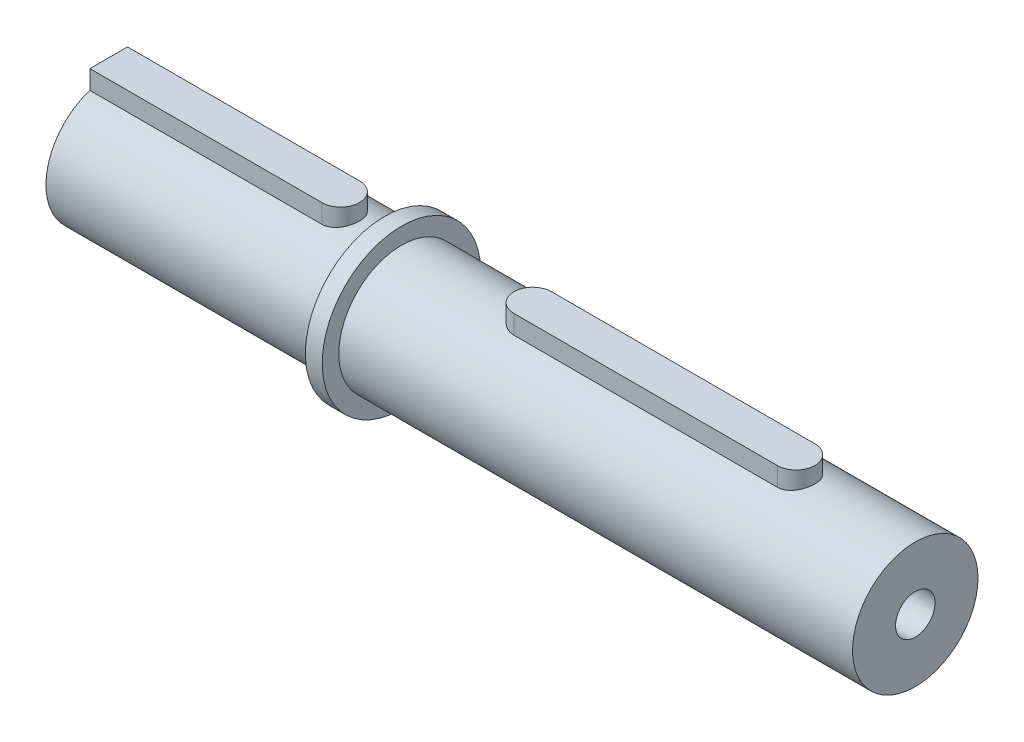
ISO-10303-21;
HEADER;
FILE_DESCRIPTION(('STEP AP214'),'2;1');
FILE_NAME('part.step','',(''),(''),'','','');
FILE_SCHEMA(('AUTOMOTIVE_DESIGN { 1 0 10303 214 1 1 1 1 }'));
ENDSEC;
DATA;
#1=APPLICATION_CONTEXT('core data for automotive mechanical design processes');
#2=APPLICATION_PROTOCOL_DEFINITION('international standard','automotive_design',2000,#1);
#3=PRODUCT_CONTEXT('',#1,'mechanical');
#4=PRODUCT('Part','Part','',(#3));
#5=PRODUCT_RELATED_PRODUCT_CATEGORY('part','',(#4));
#6=PRODUCT_DEFINITION_FORMATION('','',#4);
#7=PRODUCT_DEFINITION_CONTEXT('part definition',#1,'design');
#8=PRODUCT_DEFINITION('design','',#6,#7);
#9=PRODUCT_DEFINITION_SHAPE('','',#8);
#10=(LENGTH_UNIT() NAMED_UNIT(*) SI_UNIT(.MILLI.,.METRE.));
#11=(NAMED_UNIT(*) PLANE_ANGLE_UNIT() SI_UNIT($,.RADIAN.));
#12=(NAMED_UNIT(*) SI_UNIT($,.STERADIAN.) SOLID_ANGLE_UNIT());
#13=UNCERTAINTY_MEASURE_WITH_UNIT(LENGTH_MEASURE(1.E-05),#10,'distance_accuracy_value','');
#14=(GEOMETRIC_REPRESENTATION_CONTEXT(3) GLOBAL_UNCERTAINTY_ASSIGNED_CONTEXT((#13)) GLOBAL_UNIT_ASSIGNED_CONTEXT((#10,
#11,#12)) REPRESENTATION_CONTEXT('',''));
#15=CARTESIAN_POINT('',(0.,0.,0.));
#16=DIRECTION('',(0.,0.,1.));
#17=DIRECTION('',(1.,0.,0.));
#18=AXIS2_PLACEMENT_3D('',#15,#16,#17);
#19=CARTESIAN_POINT('',(-37.0586,0.,0.));
#20=DIRECTION('',(1.,0.,0.));
#21=DIRECTION('',(0.,0.,-1.));
#22=AXIS2_PLACEMENT_3D('',#19,#20,#21);
#23=CYLINDRICAL_SURFACE('',#22,7.9375);
#24=CARTESIAN_POINT('',(-2.1336,0.,0.));
#25=DIRECTION('',(1.,0.,0.));
#26=DIRECTION('',(0.,0.,-1.));
#27=AXIS2_PLACEMENT_3D('',#24,#25,#26);
#28=CIRCLE('',#27,7.9375);
#29=CARTESIAN_POINT('',(-2.1336,0.,-7.9375));
#30=VERTEX_POINT('',#29);
#31=EDGE_CURVE('E173',#30,#30,#28,.F.);
#32=ORIENTED_EDGE('',*,*,#31,.T.);
#33=EDGE_LOOP('',(#32));
#34=FACE_BOUND('',#33,.T.);
#35=DIRECTION('',(1.,0.,0.));
#36=VECTOR('',#35,1.);
#37=CARTESIAN_POINT('',(-37.0586,7.57189241124701,2.38125));
#38=LINE('',#37,#36);
#39=CARTESIAN_POINT('',(-37.0586,7.57189241124701,2.38125));
#40=VERTEX_POINT('',#39);
#41=CARTESIAN_POINT('',(-7.68985,7.57189241124701,2.38125));
#42=VERTEX_POINT('',#41);
#43=EDGE_CURVE('E128',#40,#42,#38,.T.);
#44=ORIENTED_EDGE('',*,*,#43,.F.);
#45=CARTESIAN_POINT('',(-37.0586,0.,0.));
#46=DIRECTION('',(-1.,0.,0.));
#47=DIRECTION('',(0.,0.,1.));
#48=AXIS2_PLACEMENT_3D('',#45,#46,#47);
#49=CIRCLE('',#48,7.9375);
#50=CARTESIAN_POINT('',(-37.0586,7.57189241124701,-2.38125));
#51=VERTEX_POINT('',#50);
#52=EDGE_CURVE('E126',#51,#40,#49,.T.);
#53=ORIENTED_EDGE('',*,*,#52,.F.);
#54=DIRECTION('',(1.,0.,0.));
#55=VECTOR('',#54,1.);
#56=CARTESIAN_POINT('',(-37.0586,7.57189241124701,-2.38125));
#57=LINE('',#56,#55);
#58=CARTESIAN_POINT('',(-7.68985,7.57189241124701,-2.38125));
#59=VERTEX_POINT('',#58);
#60=EDGE_CURVE('E58',#59,#51,#57,.F.);
#61=ORIENTED_EDGE('',*,*,#60,.F.);
#62=CARTESIAN_POINT('',(-7.68985,7.57189241124701,-2.38125));
#63=CARTESIAN_POINT('',(-7.82033384485856,7.57189376091581,-2.381248374936));
#64=CARTESIAN_POINT('',(-7.95083376832864,7.57530219456897,-2.37048846715338));
#65=CARTESIAN_POINT('',(-8.20801833372721,7.58851318055853,-2.32784403059214));
#66=CARTESIAN_POINT('',(-8.33470168607107,7.5983178693338,-2.29595244348055));
#67=CARTESIAN_POINT('',(-8.58049263113137,7.62311312695942,-2.21222495816054));
#68=CARTESIAN_POINT('',(-8.69961244204252,7.63809506641381,-2.16042223163361));
#69=CARTESIAN_POINT('',(-8.92749982021754,7.67154505419263,-2.03845194794712));
#70=CARTESIAN_POINT('',(-9.03626583441154,7.69001362427618,-1.96828164155071));
#71=CARTESIAN_POINT('',(-9.24380039504158,7.72901143719903,-1.80919047199833));
#72=CARTESIAN_POINT('',(-9.34219286298973,7.74958458194721,-1.71978966391593));
#73=CARTESIAN_POINT('',(-9.52283774772448,7.79009843324602,-1.52580377715761));
#74=CARTESIAN_POINT('',(-9.60508808983918,7.81003905822607,-1.42121674966951));
#75=CARTESIAN_POINT('',(-9.75274703598537,7.8475397814478,-1.19715190749748));
#76=CARTESIAN_POINT('',(-9.81777218630296,7.86504212393567,-1.0774108838706));
#77=CARTESIAN_POINT('',(-9.92661727373037,7.89518417024086,-0.828079124523848));
#78=CARTESIAN_POINT('',(-9.9704417841487,7.90782492265825,-0.698490520065809));
#79=CARTESIAN_POINT('',(-10.0343970017312,7.92650888030697,-0.437076616051442));
#80=CARTESIAN_POINT('',(-10.0551696401487,7.93273047323822,-0.30542134583916));
#81=CARTESIAN_POINT('',(-10.0744612528762,7.93850332383392,-0.0403571452020352));
#82=CARTESIAN_POINT('',(-10.0729849013006,7.93805598252223,0.0930514110049657));
#83=CARTESIAN_POINT('',(-10.048251321188,7.93066746060523,0.35333171110275));
#84=CARTESIAN_POINT('',(-10.0256892548269,7.92393354575815,0.480276324880612));
#85=CARTESIAN_POINT('',(-9.96056025410903,7.90498041353777,0.72848662634003));
#86=CARTESIAN_POINT('',(-9.91799205287838,7.89276084879189,0.849751953850085));
#87=CARTESIAN_POINT('',(-9.81358841282316,7.86392288316669,1.08481388058259));
#88=CARTESIAN_POINT('',(-9.75153434054393,7.84725490611263,1.19850704020223));
#89=CARTESIAN_POINT('',(-9.61009340926972,7.81128804529317,1.41408891963101));
#90=CARTESIAN_POINT('',(-9.53070243816872,7.79198853776867,1.51597483011045));
#91=CARTESIAN_POINT('',(-9.35323607068366,7.75194586397995,1.70919851442758));
#92=CARTESIAN_POINT('',(-9.25455839104719,7.73117572565343,1.79997827138306));
#93=CARTESIAN_POINT('',(-9.04317784659264,7.69118318078879,1.96385896819841));
#94=CARTESIAN_POINT('',(-8.93047358966879,7.67196092818711,2.03695815117915));
#95=CARTESIAN_POINT('',(-8.69276984258771,7.63711171298022,2.16398467593925));
#96=CARTESIAN_POINT('',(-8.56766281477861,7.62152099373927,2.21772145410068));
#97=CARTESIAN_POINT('',(-8.30959855668198,7.59613023065008,2.30319838564649));
#98=CARTESIAN_POINT('',(-8.17664390271592,7.58632829788583,2.33494571490599));
#99=CARTESIAN_POINT('',(-7.91196925230744,7.57403948673515,2.37449947824074));
#100=CARTESIAN_POINT('',(-7.78038794456323,7.57129357396497,2.38315414878891));
#101=CARTESIAN_POINT('',(-7.51764927123941,7.57271142994382,2.37864566232182));
#102=CARTESIAN_POINT('',(-7.38649184889112,7.57687423146687,2.36548555939406));
#103=CARTESIAN_POINT('',(-7.13186219996993,7.59138624207772,2.31847649674105));
#104=CARTESIAN_POINT('',(-7.0082788392313,7.60157192706134,2.28517388772178));
#105=CARTESIAN_POINT('',(-6.76846231583167,7.62681261704077,2.19945867174834));
#106=CARTESIAN_POINT('',(-6.65223029130194,7.64186837382394,2.14704311419125));
#107=CARTESIAN_POINT('',(-6.42696602578539,7.67565513099226,2.0229809552445));
#108=CARTESIAN_POINT('',(-6.31821075543503,7.69447392823342,1.95085595624209));
#109=CARTESIAN_POINT('',(-6.114037006438,7.73347776464555,1.78999041290609));
#110=CARTESIAN_POINT('',(-6.0186217295397,7.7536631300887,1.70124589161648));
#111=CARTESIAN_POINT('',(-5.8401261057691,7.79404768257711,1.50567252283359));
#112=CARTESIAN_POINT('',(-5.75764718898316,7.81421864037522,1.39828756704868));
#113=CARTESIAN_POINT('',(-5.61186536211844,7.8515345215098,1.17072058303702));
#114=CARTESIAN_POINT('',(-5.54856149972193,7.86867959510738,1.05053919073851));
#115=CARTESIAN_POINT('',(-5.44353745147283,7.89790728128995,0.801585113719538));
#116=CARTESIAN_POINT('',(-5.40165604934763,7.91002757312133,0.672885087485067));
#117=CARTESIAN_POINT('',(-5.34025329126145,7.92800642609962,0.409844821826032));
#118=CARTESIAN_POINT('',(-5.32072553780689,7.93386677877522,0.275506207550684));
#119=CARTESIAN_POINT('',(-5.30507091756348,7.93855638729221,0.010560294288853));
#120=CARTESIAN_POINT('',(-5.30807184604006,7.93764771864223,-0.119991471799355));
#121=CARTESIAN_POINT('',(-5.33530434159235,7.92951907338245,-0.378649676348493));
#122=CARTESIAN_POINT('',(-5.3595347049002,7.92229945462109,-0.506756253037615));
#123=CARTESIAN_POINT('',(-5.4279985124719,7.90243479768843,-0.755548103203157));
#124=CARTESIAN_POINT('',(-5.47201436178031,7.88984885230124,-0.876298297170335));
#125=CARTESIAN_POINT('',(-5.57860503928016,7.86055297075126,-1.10876276493138));
#126=CARTESIAN_POINT('',(-5.64118291732933,7.84384235695539,-1.2204755499803));
#127=CARTESIAN_POINT('',(-5.78544286367018,7.80738795752312,-1.43557925421764));
#128=CARTESIAN_POINT('',(-5.86767214512622,7.7875642274115,-1.53858952199687));
#129=CARTESIAN_POINT('',(-6.04791524147832,7.7473736532458,-1.72964089451169));
#130=CARTESIAN_POINT('',(-6.14593360266331,7.72700665417713,-1.81767767274307));
#131=CARTESIAN_POINT('',(-6.35847848556793,7.68732080502219,-1.97891827663846));
#132=CARTESIAN_POINT('',(-6.47340995350732,7.66805128650908,-2.05160181115756));
#133=CARTESIAN_POINT('',(-6.71441883898062,7.63353419170209,-2.17653097726931));
#134=CARTESIAN_POINT('',(-6.8404908649669,7.61828468397667,-2.22878642947196));
#135=CARTESIAN_POINT('',(-7.08618793517496,7.59504159039181,-2.30666833771057));
#136=CARTESIAN_POINT('',(-7.20504122700295,7.58644270809325,-2.3345593868033));
#137=CARTESIAN_POINT('',(-7.44587541571204,7.57486805123002,-2.37184912400791));
#138=CARTESIAN_POINT('',(-7.56785568062433,7.57189114939021,-2.38125151933426));
#139=CARTESIAN_POINT('',(-7.68985,7.57189241124701,-2.38125));
#140=B_SPLINE_CURVE_WITH_KNOTS('',3,(#62,#63,#64,#65,#66,#67,#68,#69,#70,#71,#72,#73,#74,#75,
#76,#77,#78,#79,#80,#81,#82,#83,#84,#85,#86,#87,#88,#89,#90,#91,#92,#93,#94,#95,#96,#97,#98,#99,
#100,#101,#102,#103,#104,#105,#106,#107,#108,#109,#110,#111,#112,#113,#114,#115,#116,#117,#118,
#119,#120,#121,#122,#123,#124,#125,#126,#127,#128,#129,#130,#131,#132,#133,#134,#135,#136,#137,
#138,#139),.UNSPECIFIED.,.T.,.F.,(4,2,2,2,2,2,2,2,2,2,2,2,2,2,2,2,2,2,2,2,2,2,2,2,2,2,2,2,2,2,2,
2,2,2,2,2,2,2,4),(0.,0.391001513390925,0.782133693681287,1.17261705796508,1.56315890277503,
1.96489875637674,2.36669020995646,2.77679053596911,3.18680235745755,3.58508522487423,
3.98328442136037,4.36880200010522,4.75434399475972,5.14437644820386,5.53450151337943,
5.93966533399453,6.34486939830832,6.75395903217854,7.16291510376738,7.55662828258751,
7.95028634587113,8.33371769469507,8.71720826164323,9.11099161751539,9.504869324163,
9.91361215938841,10.3223346913131,10.7279343450938,11.1334178893981,11.523286324632,
11.9131326546745,12.2987926628878,12.684516072592,13.0825815795314,13.4807619105409,
13.8908097797891,14.300660279219,14.6662958175283,15.0318580336991),.UNSPECIFIED.);
#141=EDGE_CURVE('E11',#42,#59,#140,.T.);
#142=ORIENTED_EDGE('',*,*,#141,.F.);
#143=EDGE_LOOP('',(#44,#53,#61,#142));
#144=FACE_BOUND('',#143,.T.);
#145=ADVANCED_FACE('F36',(#34,#144),#23,.T.);
#146=CARTESIAN_POINT('',(65.024,0.,0.));
#147=DIRECTION('',(-1.,0.,0.));
#148=DIRECTION('',(0.,0.,1.));
#149=AXIS2_PLACEMENT_3D('',#146,#147,#148);
#150=CYLINDRICAL_SURFACE('',#149,7.9375);
#151=CARTESIAN_POINT('',(0.,0.,0.));
#152=DIRECTION('',(1.,0.,0.));
#153=DIRECTION('',(0.,0.,-1.));
#154=AXIS2_PLACEMENT_3D('',#151,#152,#153);
#155=CIRCLE('',#154,7.9375);
#156=CARTESIAN_POINT('',(0.,0.,-7.9375));
#157=VERTEX_POINT('',#156);
#158=EDGE_CURVE('E163',#157,#157,#155,.T.);
#159=ORIENTED_EDGE('',*,*,#158,.T.);
#160=EDGE_LOOP('',(#159));
#161=FACE_BOUND('',#160,.T.);
#162=CARTESIAN_POINT('',(65.024,0.,0.));
#163=DIRECTION('',(1.,0.,0.));
#164=DIRECTION('',(0.,0.,-1.));
#165=AXIS2_PLACEMENT_3D('',#162,#163,#164);
#166=CIRCLE('',#165,7.9375);
#167=CARTESIAN_POINT('',(65.024,0.,-7.9375));
#168=VERTEX_POINT('',#167);
#169=EDGE_CURVE('E164',#168,#168,#166,.T.);
#170=ORIENTED_EDGE('',*,*,#169,.F.);
#171=EDGE_LOOP('',(#170));
#172=FACE_BOUND('',#171,.T.);
#173=CARTESIAN_POINT('',(16.60525,7.57189241124701,-2.38125));
#174=CARTESIAN_POINT('',(16.4747661551414,7.57189376091581,-2.381248374936));
#175=CARTESIAN_POINT('',(16.3442662316714,7.57530219456897,-2.37048846715338));
#176=CARTESIAN_POINT('',(16.0870816662728,7.58851318055853,-2.32784403059214));
#177=CARTESIAN_POINT('',(15.9603983139289,7.5983178693338,-2.29595244348055));
#178=CARTESIAN_POINT('',(15.7146073688686,7.62311312695942,-2.21222495816054));
#179=CARTESIAN_POINT('',(15.5954875579575,7.63809506641381,-2.16042223163361));
#180=CARTESIAN_POINT('',(15.3676001797825,7.67154505419263,-2.03845194794712));
#181=CARTESIAN_POINT('',(15.2588341655884,7.69001362427618,-1.96828164155071));
#182=CARTESIAN_POINT('',(15.0512996049584,7.72901143719903,-1.80919047199833));
#183=CARTESIAN_POINT('',(14.9529071370103,7.74958458194721,-1.71978966391593));
#184=CARTESIAN_POINT('',(14.7722622522755,7.79009843324602,-1.52580377715761));
#185=CARTESIAN_POINT('',(14.6900119101608,7.81003905822607,-1.42121674966951));
#186=CARTESIAN_POINT('',(14.5423529640146,7.8475397814478,-1.19715190749748));
#187=CARTESIAN_POINT('',(14.477327813697,7.86504212393567,-1.0774108838706));
#188=CARTESIAN_POINT('',(14.3684827262696,7.89518417024086,-0.828079124523848));
#189=CARTESIAN_POINT('',(14.3246582158513,7.90782492265825,-0.698490520065808));
#190=CARTESIAN_POINT('',(14.2607029982688,7.92650888030697,-0.437076616051441));
#191=CARTESIAN_POINT('',(14.2399303598513,7.93273047323822,-0.305421345839159));
#192=CARTESIAN_POINT('',(14.2206387471238,7.93850332383392,-0.0403571452020351));
#193=CARTESIAN_POINT('',(14.2221150986994,7.93805598252223,0.0930514110049655));
#194=CARTESIAN_POINT('',(14.246848678812,7.93066746060523,0.35333171110275));
#195=CARTESIAN_POINT('',(14.2694107451731,7.92393354575815,0.480276324880612));
#196=CARTESIAN_POINT('',(14.334539745891,7.90498041353777,0.728486626340029));
#197=CARTESIAN_POINT('',(14.3771079471216,7.89276084879189,0.849751953850085));
#198=CARTESIAN_POINT('',(14.4815115871768,7.86392288316669,1.08481388058259));
#199=CARTESIAN_POINT('',(14.5435656594561,7.84725490611263,1.19850704020223));
#200=CARTESIAN_POINT('',(14.6850065907303,7.81128804529317,1.41408891963101));
#201=CARTESIAN_POINT('',(14.7643975618313,7.79198853776867,1.51597483011045));
#202=CARTESIAN_POINT('',(14.9418639293163,7.75194586397995,1.70919851442758));
#203=CARTESIAN_POINT('',(15.0405416089528,7.73117572565343,1.79997827138306));
#204=CARTESIAN_POINT('',(15.2519221534074,7.69118318078879,1.96385896819841));
#205=CARTESIAN_POINT('',(15.3646264103312,7.67196092818711,2.03695815117915));
#206=CARTESIAN_POINT('',(15.6023301574123,7.63711171298022,2.16398467593925));
#207=CARTESIAN_POINT('',(15.7274371852214,7.62152099373927,2.21772145410068));
#208=CARTESIAN_POINT('',(15.985501443318,7.59613023065008,2.30319838564649));
#209=CARTESIAN_POINT('',(16.1184560972841,7.58632829788583,2.33494571490599));
#210=CARTESIAN_POINT('',(16.3831307476926,7.57403948673515,2.37449947824074));
#211=CARTESIAN_POINT('',(16.5147120554368,7.57129357396497,2.3831541487889));
#212=CARTESIAN_POINT('',(16.7774507287606,7.57271142994383,2.37864566232182));
#213=CARTESIAN_POINT('',(16.9086081511089,7.57687423146687,2.36548555939406));
#214=CARTESIAN_POINT('',(17.1632378000301,7.59138624207772,2.31847649674105));
#215=CARTESIAN_POINT('',(17.2868211607687,7.60157192706134,2.28517388772178));
#216=CARTESIAN_POINT('',(17.5266376841683,7.62681261704077,2.19945867174833));
#217=CARTESIAN_POINT('',(17.6428697086981,7.64186837382394,2.14704311419125));
#218=CARTESIAN_POINT('',(17.8681339742146,7.67565513099226,2.0229809552445));
#219=CARTESIAN_POINT('',(17.976889244565,7.69447392823342,1.95085595624208));
#220=CARTESIAN_POINT('',(18.181062993562,7.73347776464555,1.78999041290608));
#221=CARTESIAN_POINT('',(18.2764782704603,7.7536631300887,1.70124589161647));
#222=CARTESIAN_POINT('',(18.4549738942309,7.79404768257712,1.50567252283359));
#223=CARTESIAN_POINT('',(18.5374528110168,7.81421864037522,1.39828756704867));
#224=CARTESIAN_POINT('',(18.6832346378816,7.8515345215098,1.17072058303702));
#225=CARTESIAN_POINT('',(18.7465385002781,7.86867959510738,1.05053919073851));
#226=CARTESIAN_POINT('',(18.8515625485272,7.89790728128995,0.801585113719538));
#227=CARTESIAN_POINT('',(18.8934439506524,7.91002757312133,0.672885087485067));
#228=CARTESIAN_POINT('',(18.9548467087385,7.92800642609962,0.409844821826031));
#229=CARTESIAN_POINT('',(18.9743744621931,7.93386677877522,0.275506207550683));
#230=CARTESIAN_POINT('',(18.9900290824365,7.93855638729221,0.0105602942888515));
#231=CARTESIAN_POINT('',(18.9870281539599,7.93764771864223,-0.119991471799355));
#232=CARTESIAN_POINT('',(18.9597956584076,7.92951907338245,-0.378649676348493));
#233=CARTESIAN_POINT('',(18.9355652950998,7.92229945462109,-0.506756253037616));
#234=CARTESIAN_POINT('',(18.8671014875281,7.90243479768843,-0.755548103203158));
#235=CARTESIAN_POINT('',(18.8230856382197,7.88984885230124,-0.876298297170337));
#236=CARTESIAN_POINT('',(18.7164949607198,7.86055297075126,-1.10876276493139));
#237=CARTESIAN_POINT('',(18.6539170826707,7.8438423569554,-1.2204755499803));
#238=CARTESIAN_POINT('',(18.5096571363298,7.80738795752313,-1.43557925421765));
#239=CARTESIAN_POINT('',(18.4274278548738,7.7875642274115,-1.53858952199687));
#240=CARTESIAN_POINT('',(18.2471847585217,7.7473736532458,-1.72964089451169));
#241=CARTESIAN_POINT('',(18.1491663973367,7.72700665417713,-1.81767767274307));
#242=CARTESIAN_POINT('',(17.9366215144321,7.68732080502219,-1.97891827663846));
#243=CARTESIAN_POINT('',(17.8216900464927,7.66805128650908,-2.05160181115756));
#244=CARTESIAN_POINT('',(17.5806811610194,7.63353419170209,-2.17653097726932));
#245=CARTESIAN_POINT('',(17.4546091350331,7.61828468397667,-2.22878642947196));
#246=CARTESIAN_POINT('',(17.208912064825,7.59504159039181,-2.30666833771058));
#247=CARTESIAN_POINT('',(17.090058772997,7.58644270809325,-2.3345593868033));
#248=CARTESIAN_POINT('',(16.849224584288,7.57486805123002,-2.37184912400791));
#249=CARTESIAN_POINT('',(16.7272443193757,7.57189114939021,-2.38125151933426));
#250=CARTESIAN_POINT('',(16.60525,7.57189241124701,-2.38125));
#251=B_SPLINE_CURVE_WITH_KNOTS('',3,(#173,#174,#175,#176,#177,#178,#179,#180,#181,#182,#183,
#184,#185,#186,#187,#188,#189,#190,#191,#192,#193,#194,#195,#196,#197,#198,#199,#200,#201,#202,
#203,#204,#205,#206,#207,#208,#209,#210,#211,#212,#213,#214,#215,#216,#217,#218,#219,#220,#221,
#222,#223,#224,#225,#226,#227,#228,#229,#230,#231,#232,#233,#234,#235,#236,#237,#238,#239,#240,
#241,#242,#243,#244,#245,#246,#247,#248,#249,#250),.UNSPECIFIED.,.T.,.F.,(4,2,2,2,2,2,2,2,2,2,2,
2,2,2,2,2,2,2,2,2,2,2,2,2,2,2,2,2,2,2,2,2,2,2,2,2,2,2,4),(0.,0.391001513390925,
0.782133693681289,1.17261705796508,1.56315890277504,1.96489875637675,2.36669020995646,
2.77679053596911,3.18680235745755,3.58508522487423,3.98328442136037,4.36880200010522,
4.75434399475972,5.14437644820386,5.53450151337944,5.93966533399454,6.34486939830833,
6.75395903217854,7.16291510376738,7.55662828258751,7.95028634587113,8.33371769469507,
8.71720826164323,9.1109916175154,9.50486932416301,9.91361215938841,10.3223346913131,
10.7279343450938,11.1334178893981,11.523286324632,11.9131326546745,12.2987926628878,
12.684516072592,13.0825815795314,13.4807619105409,13.8908097797891,14.300660279219,
14.6662958175283,15.0318580336991),.UNSPECIFIED.);
#252=CARTESIAN_POINT('',(16.60525,7.57189241124701,-2.38125));
#253=VERTEX_POINT('',#252);
#254=CARTESIAN_POINT('',(16.60525,7.57189241124701,2.38125));
#255=VERTEX_POINT('',#254);
#256=EDGE_CURVE('E48',#253,#255,#251,.T.);
#257=ORIENTED_EDGE('',*,*,#256,.F.);
#258=DIRECTION('',(-1.,0.,0.));
#259=VECTOR('',#258,1.);
#260=CARTESIAN_POINT('',(65.024,7.57189241124701,-2.38125));
#261=LINE('',#260,#259);
#262=CARTESIAN_POINT('',(49.94275,7.57189241124701,-2.38125));
#263=VERTEX_POINT('',#262);
#264=EDGE_CURVE('E178',#263,#253,#261,.T.);
#265=ORIENTED_EDGE('',*,*,#264,.F.);
#266=CARTESIAN_POINT('',(49.94275,7.57189241124701,-2.38125));
#267=CARTESIAN_POINT('',(49.8122661551414,7.57189376091581,-2.381248374936));
#268=CARTESIAN_POINT('',(49.6817662316714,7.57530219456897,-2.37048846715338));
#269=CARTESIAN_POINT('',(49.4245816662728,7.58851318055854,-2.32784403059214));
#270=CARTESIAN_POINT('',(49.2978983139289,7.5983178693338,-2.29595244348055));
#271=CARTESIAN_POINT('',(49.0521073688686,7.62311312695942,-2.21222495816054));
#272=CARTESIAN_POINT('',(48.9329875579575,7.63809506641381,-2.16042223163361));
#273=CARTESIAN_POINT('',(48.7051001797825,7.67154505419263,-2.03845194794712));
#274=CARTESIAN_POINT('',(48.5963341655884,7.69001362427619,-1.96828164155071));
#275=CARTESIAN_POINT('',(48.3887996049584,7.72901143719903,-1.80919047199833));
#276=CARTESIAN_POINT('',(48.2904071370103,7.74958458194721,-1.71978966391593));
#277=CARTESIAN_POINT('',(48.1097622522755,7.79009843324602,-1.52580377715761));
#278=CARTESIAN_POINT('',(48.0275119101608,7.81003905822607,-1.42121674966952));
#279=CARTESIAN_POINT('',(47.8798529640146,7.8475397814478,-1.19715190749748));
#280=CARTESIAN_POINT('',(47.814827813697,7.86504212393567,-1.07741088387061));
#281=CARTESIAN_POINT('',(47.7059827262696,7.89518417024086,-0.828079124523849));
#282=CARTESIAN_POINT('',(47.6621582158513,7.90782492265825,-0.698490520065809));
#283=CARTESIAN_POINT('',(47.5982029982688,7.92650888030697,-0.437076616051442));
#284=CARTESIAN_POINT('',(47.5774303598513,7.93273047323822,-0.30542134583916));
#285=CARTESIAN_POINT('',(47.5581387471238,7.93850332383392,-0.0403571452020357));
#286=CARTESIAN_POINT('',(47.5596150986994,7.93805598252223,0.0930514110049652));
#287=CARTESIAN_POINT('',(47.584348678812,7.93066746060523,0.353331711102749));
#288=CARTESIAN_POINT('',(47.6069107451731,7.92393354575815,0.480276324880611));
#289=CARTESIAN_POINT('',(47.672039745891,7.90498041353777,0.728486626340029));
#290=CARTESIAN_POINT('',(47.7146079471216,7.89276084879189,0.849751953850085));
#291=CARTESIAN_POINT('',(47.8190115871768,7.86392288316669,1.08481388058259));
#292=CARTESIAN_POINT('',(47.8810656594561,7.84725490611263,1.19850704020223));
#293=CARTESIAN_POINT('',(48.0225065907303,7.81128804529317,1.41408891963101));
#294=CARTESIAN_POINT('',(48.1018975618313,7.79198853776867,1.51597483011045));
#295=CARTESIAN_POINT('',(48.2793639293163,7.75194586397995,1.70919851442758));
#296=CARTESIAN_POINT('',(48.3780416089528,7.73117572565343,1.79997827138306));
#297=CARTESIAN_POINT('',(48.5894221534074,7.69118318078879,1.96385896819841));
#298=CARTESIAN_POINT('',(48.7021264103312,7.67196092818711,2.03695815117915));
#299=CARTESIAN_POINT('',(48.9398301574123,7.63711171298022,2.16398467593925));
#300=CARTESIAN_POINT('',(49.0649371852214,7.62152099373927,2.21772145410069));
#301=CARTESIAN_POINT('',(49.323001443318,7.59613023065008,2.30319838564649));
#302=CARTESIAN_POINT('',(49.4559560972841,7.58632829788583,2.33494571490599));
#303=CARTESIAN_POINT('',(49.7206307476926,7.57403948673515,2.37449947824074));
#304=CARTESIAN_POINT('',(49.8522120554368,7.57129357396497,2.38315414878891));
#305=CARTESIAN_POINT('',(50.1149507287606,7.57271142994383,2.37864566232182));
#306=CARTESIAN_POINT('',(50.2461081511089,7.57687423146687,2.36548555939406));
#307=CARTESIAN_POINT('',(50.5007378000301,7.59138624207772,2.31847649674105));
#308=CARTESIAN_POINT('',(50.6243211607687,7.60157192706134,2.28517388772178));
#309=CARTESIAN_POINT('',(50.8641376841683,7.62681261704077,2.19945867174833));
#310=CARTESIAN_POINT('',(50.9803697086981,7.64186837382394,2.14704311419125));
#311=CARTESIAN_POINT('',(51.2056339742146,7.67565513099226,2.0229809552445));
#312=CARTESIAN_POINT('',(51.314389244565,7.69447392823342,1.95085595624208));
#313=CARTESIAN_POINT('',(51.518562993562,7.73347776464555,1.78999041290608));
#314=CARTESIAN_POINT('',(51.6139782704603,7.7536631300887,1.70124589161647));
#315=CARTESIAN_POINT('',(51.7924738942309,7.79404768257712,1.50567252283359));
#316=CARTESIAN_POINT('',(51.8749528110168,7.81421864037522,1.39828756704867));
#317=CARTESIAN_POINT('',(52.0207346378816,7.8515345215098,1.17072058303701));
#318=CARTESIAN_POINT('',(52.0840385002781,7.86867959510738,1.0505391907385));
#319=CARTESIAN_POINT('',(52.1890625485272,7.89790728128995,0.801585113719533));
#320=CARTESIAN_POINT('',(52.2309439506524,7.91002757312133,0.672885087485063));
#321=CARTESIAN_POINT('',(52.2923467087385,7.92800642609962,0.409844821826028));
#322=CARTESIAN_POINT('',(52.3118744621931,7.93386677877522,0.275506207550681));
#323=CARTESIAN_POINT('',(52.3275290824365,7.93855638729221,0.0105602942888508));
#324=CARTESIAN_POINT('',(52.3245281539599,7.93764771864223,-0.119991471799356));
#325=CARTESIAN_POINT('',(52.2972956584076,7.92951907338245,-0.378649676348494));
#326=CARTESIAN_POINT('',(52.2730652950998,7.92229945462109,-0.506756253037617));
#327=CARTESIAN_POINT('',(52.2046014875281,7.90243479768843,-0.755548103203159));
#328=CARTESIAN_POINT('',(52.1605856382197,7.88984885230124,-0.876298297170338));
#329=CARTESIAN_POINT('',(52.0539949607198,7.86055297075126,-1.10876276493139));
#330=CARTESIAN_POINT('',(51.9914170826707,7.84384235695539,-1.2204755499803));
#331=CARTESIAN_POINT('',(51.8471571363298,7.80738795752312,-1.43557925421764));
#332=CARTESIAN_POINT('',(51.7649278548738,7.7875642274115,-1.53858952199687));
#333=CARTESIAN_POINT('',(51.5846847585217,7.7473736532458,-1.72964089451169));
#334=CARTESIAN_POINT('',(51.4866663973367,7.72700665417713,-1.81767767274307));
#335=CARTESIAN_POINT('',(51.2741215144321,7.68732080502219,-1.97891827663846));
#336=CARTESIAN_POINT('',(51.1591900464927,7.66805128650908,-2.05160181115756));
#337=CARTESIAN_POINT('',(50.9181811610194,7.63353419170209,-2.17653097726932));
#338=CARTESIAN_POINT('',(50.7921091350331,7.61828468397667,-2.22878642947196));
#339=CARTESIAN_POINT('',(50.546412064825,7.59504159039181,-2.30666833771058));
#340=CARTESIAN_POINT('',(50.427558772997,7.58644270809325,-2.3345593868033));
#341=CARTESIAN_POINT('',(50.1867245842879,7.57486805123002,-2.37184912400791));
#342=CARTESIAN_POINT('',(50.0647443193757,7.57189114939021,-2.38125151933426));
#343=CARTESIAN_POINT('',(49.94275,7.57189241124701,-2.38125));
#344=B_SPLINE_CURVE_WITH_KNOTS('',3,(#266,#267,#268,#269,#270,#271,#272,#273,#274,#275,#276,
#277,#278,#279,#280,#281,#282,#283,#284,#285,#286,#287,#288,#289,#290,#291,#292,#293,#294,#295,
#296,#297,#298,#299,#300,#301,#302,#303,#304,#305,#306,#307,#308,#309,#310,#311,#312,#313,#314,
#315,#316,#317,#318,#319,#320,#321,#322,#323,#324,#325,#326,#327,#328,#329,#330,#331,#332,#333,
#334,#335,#336,#337,#338,#339,#340,#341,#342,#343),.UNSPECIFIED.,.T.,.F.,(4,2,2,2,2,2,2,2,2,2,2,
2,2,2,2,2,2,2,2,2,2,2,2,2,2,2,2,2,2,2,2,2,2,2,2,2,2,2,4),(0.,0.391001513390925,
0.782133693681289,1.17261705796509,1.56315890277504,1.96489875637674,2.36669020995646,
2.77679053596911,3.18680235745755,3.58508522487423,3.98328442136037,4.36880200010522,
4.75434399475972,5.14437644820386,5.53450151337943,5.93966533399453,6.34486939830833,
6.75395903217854,7.16291510376739,7.55662828258753,7.95028634587113,8.33371769469507,
8.71720826164323,9.1109916175154,9.50486932416301,9.91361215938842,10.3223346913131,
10.7279343450938,11.1334178893981,11.523286324632,11.9131326546745,12.2987926628878,
12.684516072592,13.0825815795313,13.4807619105409,13.8908097797891,14.300660279219,
14.6662958175283,15.0318580336991),.UNSPECIFIED.);
#345=CARTESIAN_POINT('',(49.94275,7.57189241124701,2.38125));
#346=VERTEX_POINT('',#345);
#347=EDGE_CURVE('E181',#346,#263,#344,.T.);
#348=ORIENTED_EDGE('',*,*,#347,.F.);
#349=DIRECTION('',(-1.,0.,0.));
#350=VECTOR('',#349,1.);
#351=CARTESIAN_POINT('',(65.024,7.57189241124701,2.38125));
#352=LINE('',#351,#350);
#353=EDGE_CURVE('E188',#255,#346,#352,.F.);
#354=ORIENTED_EDGE('',*,*,#353,.F.);
#355=EDGE_LOOP('',(#257,#265,#348,#354));
#356=FACE_BOUND('',#355,.T.);
#357=ADVANCED_FACE('F189',(#161,#172,#356),#150,.T.);
#358=CARTESIAN_POINT('',(-2.1336,0.,0.));
#359=DIRECTION('',(1.,0.,0.));
#360=DIRECTION('',(0.,0.,-1.));
#361=AXIS2_PLACEMENT_3D('',#358,#359,#360);
#362=PLANE('',#361);
#363=CARTESIAN_POINT('',(-2.1336,0.,0.));
#364=DIRECTION('',(1.,0.,0.));
#365=DIRECTION('',(0.,0.,-1.));
#366=AXIS2_PLACEMENT_3D('',#363,#364,#365);
#367=CIRCLE('',#366,10.033);
#368=CARTESIAN_POINT('',(-2.1336,0.,-10.033));
#369=VERTEX_POINT('',#368);
#370=EDGE_CURVE('E170',#369,#369,#367,.T.);
#371=ORIENTED_EDGE('',*,*,#370,.F.);
#372=EDGE_LOOP('',(#371));
#373=FACE_BOUND('',#372,.T.);
#374=ORIENTED_EDGE('',*,*,#31,.F.);
#375=EDGE_LOOP('',(#374));
#376=FACE_BOUND('',#375,.T.);
#377=ADVANCED_FACE('F226',(#373,#376),#362,.F.);
#378=CARTESIAN_POINT('',(0.,0.,0.));
#379=DIRECTION('',(1.,0.,0.));
#380=DIRECTION('',(0.,0.,-1.));
#381=AXIS2_PLACEMENT_3D('',#378,#379,#380);
#382=PLANE('',#381);
#383=CARTESIAN_POINT('',(0.,0.,0.));
#384=DIRECTION('',(1.,0.,0.));
#385=DIRECTION('',(0.,0.,-1.));
#386=AXIS2_PLACEMENT_3D('',#383,#384,#385);
#387=CIRCLE('',#386,10.033);
#388=CARTESIAN_POINT('',(0.,0.,-10.033));
#389=VERTEX_POINT('',#388);
#390=EDGE_CURVE('E167',#389,#389,#387,.T.);
#391=ORIENTED_EDGE('',*,*,#390,.T.);
#392=EDGE_LOOP('',(#391));
#393=FACE_BOUND('',#392,.T.);
#394=ORIENTED_EDGE('',*,*,#158,.F.);
#395=EDGE_LOOP('',(#394));
#396=FACE_BOUND('',#395,.T.);
#397=ADVANCED_FACE('F232',(#393,#396),#382,.T.);
#398=CARTESIAN_POINT('',(-2.1336,0.,0.));
#399=DIRECTION('',(1.,0.,0.));
#400=DIRECTION('',(0.,0.,-1.));
#401=AXIS2_PLACEMENT_3D('',#398,#399,#400);
#402=CYLINDRICAL_SURFACE('',#401,10.033);
#403=ORIENTED_EDGE('',*,*,#370,.T.);
#404=EDGE_LOOP('',(#403));
#405=FACE_BOUND('',#404,.T.);
#406=ORIENTED_EDGE('',*,*,#390,.F.);
#407=EDGE_LOOP('',(#406));
#408=FACE_BOUND('',#407,.T.);
#409=ADVANCED_FACE('F38',(#405,#408),#402,.T.);
#410=CARTESIAN_POINT('',(65.024,0.,0.));
#411=DIRECTION('',(1.,0.,0.));
#412=DIRECTION('',(0.,0.,-1.));
#413=AXIS2_PLACEMENT_3D('',#410,#411,#412);
#414=PLANE('',#413);
#415=CARTESIAN_POINT('',(65.024,0.,0.));
#416=DIRECTION('',(1.,0.,0.));
#417=DIRECTION('',(0.,0.,-1.));
#418=AXIS2_PLACEMENT_3D('',#415,#416,#417);
#419=CIRCLE('',#418,2.49999999999999);
#420=CARTESIAN_POINT('',(65.024,0.,-2.49999999999999));
#421=VERTEX_POINT('',#420);
#422=EDGE_CURVE('E157',#421,#421,#419,.T.);
#423=ORIENTED_EDGE('',*,*,#422,.F.);
#424=EDGE_LOOP('',(#423));
#425=FACE_BOUND('',#424,.T.);
#426=ORIENTED_EDGE('',*,*,#169,.T.);
#427=EDGE_LOOP('',(#426));
#428=FACE_BOUND('',#427,.T.);
#429=ADVANCED_FACE('F239',(#425,#428),#414,.T.);
#430=CARTESIAN_POINT('',(50.038,0.,0.));
#431=DIRECTION('',(1.,0.,0.));
#432=DIRECTION('',(0.,0.,-1.));
#433=AXIS2_PLACEMENT_3D('',#430,#431,#432);
#434=CONICAL_SURFACE('',#433,2.49999999999999,1.02974425867665);
#435=CARTESIAN_POINT('',(48.5358484524311,0.,0.));
#436=VERTEX_POINT('',#435);
#437=VERTEX_LOOP('',#436);
#438=FACE_BOUND('',#437,.T.);
#439=CARTESIAN_POINT('',(50.038,0.,0.));
#440=DIRECTION('',(1.,0.,0.));
#441=DIRECTION('',(0.,0.,-1.));
#442=AXIS2_PLACEMENT_3D('',#439,#440,#441);
#443=CIRCLE('',#442,2.49999999999999);
#444=CARTESIAN_POINT('',(50.038,0.,-2.49999999999999));
#445=VERTEX_POINT('',#444);
#446=EDGE_CURVE('E160',#445,#445,#443,.T.);
#447=ORIENTED_EDGE('',*,*,#446,.T.);
#448=EDGE_LOOP('',(#447));
#449=FACE_BOUND('',#448,.T.);
#450=ADVANCED_FACE('F241',(#438,#449),#434,.F.);
#451=CARTESIAN_POINT('',(65.024,0.,0.));
#452=DIRECTION('',(1.,0.,0.));
#453=DIRECTION('',(0.,0.,-1.));
#454=AXIS2_PLACEMENT_3D('',#451,#452,#453);
#455=CYLINDRICAL_SURFACE('',#454,2.49999999999999);
#456=ORIENTED_EDGE('',*,*,#446,.F.);
#457=EDGE_LOOP('',(#456));
#458=FACE_BOUND('',#457,.T.);
#459=ORIENTED_EDGE('',*,*,#422,.T.);
#460=EDGE_LOOP('',(#459));
#461=FACE_BOUND('',#460,.T.);
#462=ADVANCED_FACE('F247',(#458,#461),#455,.F.);
#463=CARTESIAN_POINT('',(-37.0586,0.,0.));
#464=DIRECTION('',(-1.,0.,0.));
#465=DIRECTION('',(0.,0.,1.));
#466=AXIS2_PLACEMENT_3D('',#463,#464,#465);
#467=PLANE('',#466);
#468=ORIENTED_EDGE('',*,*,#52,.T.);
#469=DIRECTION('',(0.,-1.,0.));
#470=VECTOR('',#469,1.);
#471=CARTESIAN_POINT('',(-37.0586,9.9568,2.38125));
#472=LINE('',#471,#470);
#473=CARTESIAN_POINT('',(-37.0586,9.9568,2.38125));
#474=VERTEX_POINT('',#473);
#475=EDGE_CURVE('E108',#474,#40,#472,.T.);
#476=ORIENTED_EDGE('',*,*,#475,.F.);
#477=DIRECTION('',(0.,0.,1.));
#478=VECTOR('',#477,1.);
#479=CARTESIAN_POINT('',(-37.0586,9.9568,-2.38125));
#480=LINE('',#479,#478);
#481=CARTESIAN_POINT('',(-37.0586,9.9568,-2.38125));
#482=VERTEX_POINT('',#481);
#483=EDGE_CURVE('E114',#482,#474,#480,.T.);
#484=ORIENTED_EDGE('',*,*,#483,.F.);
#485=DIRECTION('',(0.,-1.,0.));
#486=VECTOR('',#485,1.);
#487=CARTESIAN_POINT('',(-37.0586,9.9568,-2.38125));
#488=LINE('',#487,#486);
#489=EDGE_CURVE('E392',#482,#51,#488,.T.);
#490=ORIENTED_EDGE('',*,*,#489,.T.);
#491=EDGE_LOOP('',(#468,#476,#484,#490));
#492=FACE_BOUND('',#491,.T.);
#493=ADVANCED_FACE('F125',(#492),#467,.T.);
#494=CARTESIAN_POINT('',(16.60525,9.9568,0.));
#495=DIRECTION('',(0.,-1.,0.));
#496=DIRECTION('',(0.,0.,-1.));
#497=AXIS2_PLACEMENT_3D('',#494,#495,#496);
#498=CYLINDRICAL_SURFACE('',#497,2.38125);
#499=DIRECTION('',(0.,-1.,0.));
#500=VECTOR('',#499,1.);
#501=CARTESIAN_POINT('',(16.60525,9.9568,-2.38125));
#502=LINE('',#501,#500);
#503=CARTESIAN_POINT('',(16.60525,9.9568,-2.38125));
#504=VERTEX_POINT('',#503);
#505=EDGE_CURVE('E144',#504,#253,#502,.T.);
#506=ORIENTED_EDGE('',*,*,#505,.T.);
#507=ORIENTED_EDGE('',*,*,#256,.T.);
#508=DIRECTION('',(0.,-1.,0.));
#509=VECTOR('',#508,1.);
#510=CARTESIAN_POINT('',(16.60525,9.9568,2.38125));
#511=LINE('',#510,#509);
#512=CARTESIAN_POINT('',(16.60525,9.9568,2.38125));
#513=VERTEX_POINT('',#512);
#514=EDGE_CURVE('E153',#513,#255,#511,.T.);
#515=ORIENTED_EDGE('',*,*,#514,.F.);
#516=CARTESIAN_POINT('',(16.60525,9.9568,0.));
#517=DIRECTION('',(0.,1.,0.));
#518=DIRECTION('',(0.,0.,1.));
#519=AXIS2_PLACEMENT_3D('',#516,#517,#518);
#520=CIRCLE('',#519,2.38125);
#521=EDGE_CURVE('E135',#504,#513,#520,.T.);
#522=ORIENTED_EDGE('',*,*,#521,.F.);
#523=EDGE_LOOP('',(#506,#507,#515,#522));
#524=FACE_BOUND('',#523,.T.);
#525=ADVANCED_FACE('F204',(#524),#498,.T.);
#526=CARTESIAN_POINT('',(16.60525,9.9568,2.38125));
#527=DIRECTION('',(0.,0.,-1.));
#528=DIRECTION('',(-1.,0.,0.));
#529=AXIS2_PLACEMENT_3D('',#526,#527,#528);
#530=PLANE('',#529);
#531=ORIENTED_EDGE('',*,*,#514,.T.);
#532=ORIENTED_EDGE('',*,*,#353,.T.);
#533=DIRECTION('',(0.,-1.,0.));
#534=VECTOR('',#533,1.);
#535=CARTESIAN_POINT('',(49.94275,9.9568,2.38125));
#536=LINE('',#535,#534);
#537=CARTESIAN_POINT('',(49.94275,9.9568,2.38125));
#538=VERTEX_POINT('',#537);
#539=EDGE_CURVE('E150',#538,#346,#536,.T.);
#540=ORIENTED_EDGE('',*,*,#539,.F.);
#541=DIRECTION('',(1.,0.,0.));
#542=VECTOR('',#541,1.);
#543=CARTESIAN_POINT('',(16.60525,9.9568,2.38125));
#544=LINE('',#543,#542);
#545=EDGE_CURVE('E138',#513,#538,#544,.T.);
#546=ORIENTED_EDGE('',*,*,#545,.F.);
#547=EDGE_LOOP('',(#531,#532,#540,#546));
#548=FACE_BOUND('',#547,.T.);
#549=ADVANCED_FACE('F199',(#548),#530,.F.);
#550=CARTESIAN_POINT('',(49.94275,9.9568,0.));
#551=DIRECTION('',(0.,-1.,0.));
#552=DIRECTION('',(0.,0.,-1.));
#553=AXIS2_PLACEMENT_3D('',#550,#551,#552);
#554=CYLINDRICAL_SURFACE('',#553,2.38125);
#555=ORIENTED_EDGE('',*,*,#539,.T.);
#556=ORIENTED_EDGE('',*,*,#347,.T.);
#557=DIRECTION('',(0.,-1.,0.));
#558=VECTOR('',#557,1.);
#559=CARTESIAN_POINT('',(49.94275,9.9568,-2.38125));
#560=LINE('',#559,#558);
#561=CARTESIAN_POINT('',(49.94275,9.9568,-2.38125));
#562=VERTEX_POINT('',#561);
#563=EDGE_CURVE('E147',#562,#263,#560,.T.);
#564=ORIENTED_EDGE('',*,*,#563,.F.);
#565=CARTESIAN_POINT('',(49.94275,9.9568,0.));
#566=DIRECTION('',(0.,1.,0.));
#567=DIRECTION('',(0.,0.,1.));
#568=AXIS2_PLACEMENT_3D('',#565,#566,#567);
#569=CIRCLE('',#568,2.38125);
#570=EDGE_CURVE('E140',#538,#562,#569,.T.);
#571=ORIENTED_EDGE('',*,*,#570,.F.);
#572=EDGE_LOOP('',(#555,#556,#564,#571));
#573=FACE_BOUND('',#572,.T.);
#574=ADVANCED_FACE('F193',(#573),#554,.T.);
#575=CARTESIAN_POINT('',(16.60525,9.9568,-2.38125));
#576=DIRECTION('',(0.,0.,1.));
#577=DIRECTION('',(1.,0.,0.));
#578=AXIS2_PLACEMENT_3D('',#575,#576,#577);
#579=PLANE('',#578);
#580=ORIENTED_EDGE('',*,*,#563,.T.);
#581=ORIENTED_EDGE('',*,*,#264,.T.);
#582=ORIENTED_EDGE('',*,*,#505,.F.);
#583=DIRECTION('',(-1.,0.,0.));
#584=VECTOR('',#583,1.);
#585=CARTESIAN_POINT('',(16.60525,9.9568,-2.38125));
#586=LINE('',#585,#584);
#587=EDGE_CURVE('E142',#562,#504,#586,.T.);
#588=ORIENTED_EDGE('',*,*,#587,.F.);
#589=EDGE_LOOP('',(#580,#581,#582,#588));
#590=FACE_BOUND('',#589,.T.);
#591=ADVANCED_FACE('F198',(#590),#579,.F.);
#592=CARTESIAN_POINT('',(16.60525,9.9568,0.));
#593=DIRECTION('',(0.,1.,0.));
#594=DIRECTION('',(0.,0.,1.));
#595=AXIS2_PLACEMENT_3D('',#592,#593,#594);
#596=PLANE('',#595);
#597=ORIENTED_EDGE('',*,*,#521,.T.);
#598=ORIENTED_EDGE('',*,*,#545,.T.);
#599=ORIENTED_EDGE('',*,*,#570,.T.);
#600=ORIENTED_EDGE('',*,*,#587,.T.);
#601=EDGE_LOOP('',(#597,#598,#599,#600));
#602=FACE_BOUND('',#601,.T.);
#603=ADVANCED_FACE('F221',(#602),#596,.T.);
#604=CARTESIAN_POINT('',(-7.68985,9.9568,0.));
#605=DIRECTION('',(0.,-1.,0.));
#606=DIRECTION('',(0.,0.,-1.));
#607=AXIS2_PLACEMENT_3D('',#604,#605,#606);
#608=CYLINDRICAL_SURFACE('',#607,2.38125);
#609=DIRECTION('',(0.,-1.,0.));
#610=VECTOR('',#609,1.);
#611=CARTESIAN_POINT('',(-7.68985,9.9568,2.38125));
#612=LINE('',#611,#610);
#613=CARTESIAN_POINT('',(-7.68985,9.9568,2.38125));
#614=VERTEX_POINT('',#613);
#615=EDGE_CURVE('E110',#614,#42,#612,.T.);
#616=ORIENTED_EDGE('',*,*,#615,.T.);
#617=ORIENTED_EDGE('',*,*,#141,.T.);
#618=DIRECTION('',(0.,-1.,0.));
#619=VECTOR('',#618,1.);
#620=CARTESIAN_POINT('',(-7.68985,9.9568,-2.38125));
#621=LINE('',#620,#619);
#622=CARTESIAN_POINT('',(-7.68985,9.9568,-2.38125));
#623=VERTEX_POINT('',#622);
#624=EDGE_CURVE('E130',#623,#59,#621,.T.);
#625=ORIENTED_EDGE('',*,*,#624,.F.);
#626=CARTESIAN_POINT('',(-7.68985,9.9568,0.));
#627=DIRECTION('',(0.,1.,0.));
#628=DIRECTION('',(0.,0.,1.));
#629=AXIS2_PLACEMENT_3D('',#626,#627,#628);
#630=CIRCLE('',#629,2.38125);
#631=EDGE_CURVE('E113',#614,#623,#630,.T.);
#632=ORIENTED_EDGE('',*,*,#631,.F.);
#633=EDGE_LOOP('',(#616,#617,#625,#632));
#634=FACE_BOUND('',#633,.T.);
#635=ADVANCED_FACE('F287',(#634),#608,.T.);
#636=CARTESIAN_POINT('',(-37.0586,9.9568,2.38125));
#637=DIRECTION('',(0.,0.,-1.));
#638=DIRECTION('',(-1.,0.,0.));
#639=AXIS2_PLACEMENT_3D('',#636,#637,#638);
#640=PLANE('',#639);
#641=ORIENTED_EDGE('',*,*,#475,.T.);
#642=ORIENTED_EDGE('',*,*,#43,.T.);
#643=ORIENTED_EDGE('',*,*,#615,.F.);
#644=DIRECTION('',(1.,0.,0.));
#645=VECTOR('',#644,1.);
#646=CARTESIAN_POINT('',(-37.0586,9.9568,2.38125));
#647=LINE('',#646,#645);
#648=EDGE_CURVE('E104',#474,#614,#647,.T.);
#649=ORIENTED_EDGE('',*,*,#648,.F.);
#650=EDGE_LOOP('',(#641,#642,#643,#649));
#651=FACE_BOUND('',#650,.T.);
#652=ADVANCED_FACE('F106',(#651),#640,.F.);
#653=CARTESIAN_POINT('',(-37.0586,9.9568,-2.38125));
#654=DIRECTION('',(0.,0.,1.));
#655=DIRECTION('',(1.,0.,0.));
#656=AXIS2_PLACEMENT_3D('',#653,#654,#655);
#657=PLANE('',#656);
#658=ORIENTED_EDGE('',*,*,#624,.T.);
#659=ORIENTED_EDGE('',*,*,#60,.T.);
#660=ORIENTED_EDGE('',*,*,#489,.F.);
#661=DIRECTION('',(-1.,0.,0.));
#662=VECTOR('',#661,1.);
#663=CARTESIAN_POINT('',(-37.0586,9.9568,-2.38125));
#664=LINE('',#663,#662);
#665=EDGE_CURVE('E119',#623,#482,#664,.T.);
#666=ORIENTED_EDGE('',*,*,#665,.F.);
#667=EDGE_LOOP('',(#658,#659,#660,#666));
#668=FACE_BOUND('',#667,.T.);
#669=ADVANCED_FACE('F299',(#668),#657,.F.);
#670=CARTESIAN_POINT('',(-7.68985,9.9568,0.));
#671=DIRECTION('',(0.,1.,0.));
#672=DIRECTION('',(0.,0.,1.));
#673=AXIS2_PLACEMENT_3D('',#670,#671,#672);
#674=PLANE('',#673);
#675=ORIENTED_EDGE('',*,*,#483,.T.);
#676=ORIENTED_EDGE('',*,*,#648,.T.);
#677=ORIENTED_EDGE('',*,*,#631,.T.);
#678=ORIENTED_EDGE('',*,*,#665,.T.);
#679=EDGE_LOOP('',(#675,#676,#677,#678));
#680=FACE_BOUND('',#679,.T.);
#681=ADVANCED_FACE('F117',(#680),#674,.T.);
#682=CLOSED_SHELL('',(#145,#357,#377,#397,#409,#429,#450,#462,#493,#525,#549,#574,#591,#603,
#635,#652,#669,#681));
#683=MANIFOLD_SOLID_BREP('B2',#682);
#684=ADVANCED_BREP_SHAPE_REPRESENTATION('',(#18,#683),#14);
#685=SHAPE_DEFINITION_REPRESENTATION(#9,#684);
ENDSEC;
END-ISO-10303-21;
